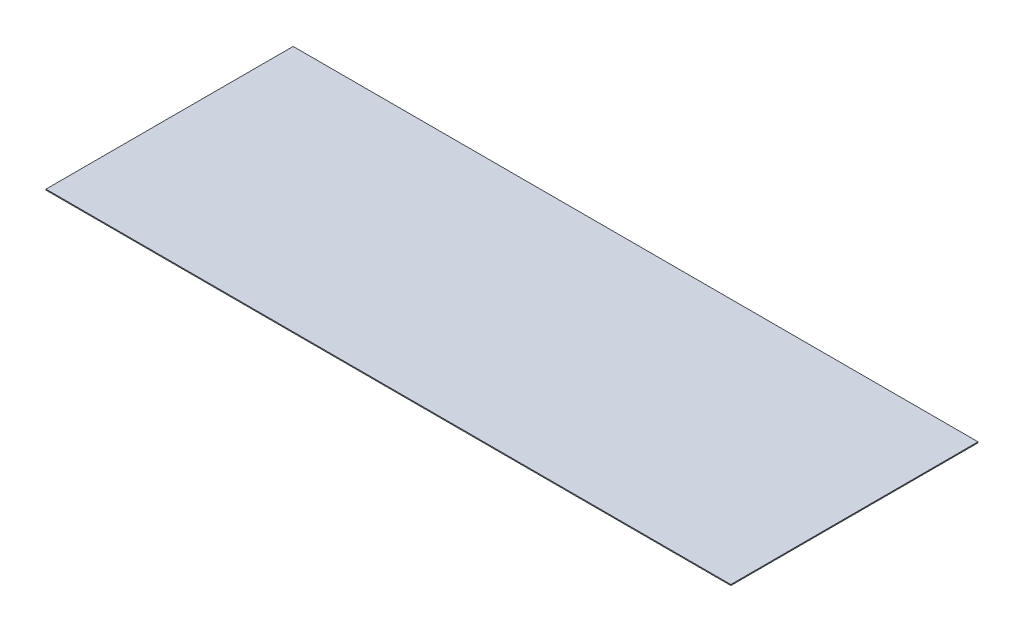
ISO-10303-21;
HEADER;
FILE_DESCRIPTION(('STEP AP214'),'2;1');
FILE_NAME('part.step','',(''),(''),'','','');
FILE_SCHEMA(('AUTOMOTIVE_DESIGN { 1 0 10303 214 1 1 1 1 }'));
ENDSEC;
DATA;
#1=APPLICATION_CONTEXT('core data for automotive mechanical design processes');
#2=APPLICATION_PROTOCOL_DEFINITION('international standard','automotive_design',2000,#1);
#3=PRODUCT_CONTEXT('',#1,'mechanical');
#4=PRODUCT('Part','Part','',(#3));
#5=PRODUCT_RELATED_PRODUCT_CATEGORY('part','',(#4));
#6=PRODUCT_DEFINITION_FORMATION('','',#4);
#7=PRODUCT_DEFINITION_CONTEXT('part definition',#1,'design');
#8=PRODUCT_DEFINITION('design','',#6,#7);
#9=PRODUCT_DEFINITION_SHAPE('','',#8);
#10=(LENGTH_UNIT() NAMED_UNIT(*) SI_UNIT(.MILLI.,.METRE.));
#11=(NAMED_UNIT(*) PLANE_ANGLE_UNIT() SI_UNIT($,.RADIAN.));
#12=(NAMED_UNIT(*) SI_UNIT($,.STERADIAN.) SOLID_ANGLE_UNIT());
#13=UNCERTAINTY_MEASURE_WITH_UNIT(LENGTH_MEASURE(1.E-05),#10,'distance_accuracy_value','');
#14=(GEOMETRIC_REPRESENTATION_CONTEXT(3) GLOBAL_UNCERTAINTY_ASSIGNED_CONTEXT((#13)) GLOBAL_UNIT_ASSIGNED_CONTEXT((#10,
#11,#12)) REPRESENTATION_CONTEXT('',''));
#15=CARTESIAN_POINT('',(0.,0.,0.));
#16=DIRECTION('',(0.,0.,1.));
#17=DIRECTION('',(1.,0.,0.));
#18=AXIS2_PLACEMENT_3D('',#15,#16,#17);
#19=CARTESIAN_POINT('',(-527.144686299616,1.5875,-240.749039692702));
#20=DIRECTION('',(1.,0.,0.));
#21=DIRECTION('',(0.,0.,-1.));
#22=AXIS2_PLACEMENT_3D('',#19,#20,#21);
#23=PLANE('',#22);
#24=DIRECTION('',(0.,0.,1.));
#25=VECTOR('',#24,1.);
#26=CARTESIAN_POINT('',(-527.144686299616,0.,-240.749039692702));
#27=LINE('',#26,#25);
#28=CARTESIAN_POINT('',(-527.144686299616,0.,-240.749039692702));
#29=VERTEX_POINT('',#28);
#30=CARTESIAN_POINT('',(-527.144686299616,0.,174.250960307298));
#31=VERTEX_POINT('',#30);
#32=EDGE_CURVE('E100',#29,#31,#27,.T.);
#33=ORIENTED_EDGE('',*,*,#32,.T.);
#34=DIRECTION('',(0.,-1.,0.));
#35=VECTOR('',#34,1.);
#36=CARTESIAN_POINT('',(-527.144686299616,1.5875,174.250960307298));
#37=LINE('',#36,#35);
#38=CARTESIAN_POINT('',(-527.144686299616,1.5875,174.250960307298));
#39=VERTEX_POINT('',#38);
#40=EDGE_CURVE('E11',#39,#31,#37,.T.);
#41=ORIENTED_EDGE('',*,*,#40,.F.);
#42=DIRECTION('',(0.,0.,1.));
#43=VECTOR('',#42,1.);
#44=CARTESIAN_POINT('',(-527.144686299616,1.5875,-240.749039692702));
#45=LINE('',#44,#43);
#46=CARTESIAN_POINT('',(-527.144686299616,1.5875,-240.749039692702));
#47=VERTEX_POINT('',#46);
#48=EDGE_CURVE('E88',#47,#39,#45,.T.);
#49=ORIENTED_EDGE('',*,*,#48,.F.);
#50=DIRECTION('',(0.,-1.,0.));
#51=VECTOR('',#50,1.);
#52=CARTESIAN_POINT('',(-527.144686299616,1.5875,-240.749039692702));
#53=LINE('',#52,#51);
#54=EDGE_CURVE('E96',#47,#29,#53,.T.);
#55=ORIENTED_EDGE('',*,*,#54,.T.);
#56=EDGE_LOOP('',(#33,#41,#49,#55));
#57=FACE_BOUND('',#56,.T.);
#58=ADVANCED_FACE('F37',(#57),#23,.F.);
#59=CARTESIAN_POINT('',(-527.144686299616,1.5875,174.250960307298));
#60=DIRECTION('',(0.,0.,-1.));
#61=DIRECTION('',(-1.,0.,0.));
#62=AXIS2_PLACEMENT_3D('',#59,#60,#61);
#63=PLANE('',#62);
#64=DIRECTION('',(1.,0.,0.));
#65=VECTOR('',#64,1.);
#66=CARTESIAN_POINT('',(-527.144686299616,0.,174.250960307298));
#67=LINE('',#66,#65);
#68=CARTESIAN_POINT('',(622.855313700384,0.,174.250960307298));
#69=VERTEX_POINT('',#68);
#70=EDGE_CURVE('E92',#31,#69,#67,.T.);
#71=ORIENTED_EDGE('',*,*,#70,.T.);
#72=DIRECTION('',(0.,-1.,0.));
#73=VECTOR('',#72,1.);
#74=CARTESIAN_POINT('',(622.855313700384,1.5875,174.250960307298));
#75=LINE('',#74,#73);
#76=CARTESIAN_POINT('',(622.855313700384,1.5875,174.250960307298));
#77=VERTEX_POINT('',#76);
#78=EDGE_CURVE('E45',#77,#69,#75,.T.);
#79=ORIENTED_EDGE('',*,*,#78,.F.);
#80=DIRECTION('',(1.,0.,0.));
#81=VECTOR('',#80,1.);
#82=CARTESIAN_POINT('',(-527.144686299616,1.5875,174.250960307298));
#83=LINE('',#82,#81);
#84=EDGE_CURVE('E83',#39,#77,#83,.T.);
#85=ORIENTED_EDGE('',*,*,#84,.F.);
#86=ORIENTED_EDGE('',*,*,#40,.T.);
#87=EDGE_LOOP('',(#71,#79,#85,#86));
#88=FACE_BOUND('',#87,.T.);
#89=ADVANCED_FACE('F91',(#88),#63,.F.);
#90=CARTESIAN_POINT('',(622.855313700384,1.5875,-240.749039692702));
#91=DIRECTION('',(-1.,0.,0.));
#92=DIRECTION('',(0.,0.,1.));
#93=AXIS2_PLACEMENT_3D('',#90,#91,#92);
#94=PLANE('',#93);
#95=DIRECTION('',(0.,0.,-1.));
#96=VECTOR('',#95,1.);
#97=CARTESIAN_POINT('',(622.855313700384,0.,-240.749039692702));
#98=LINE('',#97,#96);
#99=CARTESIAN_POINT('',(622.855313700384,0.,-240.749039692702));
#100=VERTEX_POINT('',#99);
#101=EDGE_CURVE('E70',#69,#100,#98,.T.);
#102=ORIENTED_EDGE('',*,*,#101,.T.);
#103=DIRECTION('',(0.,-1.,0.));
#104=VECTOR('',#103,1.);
#105=CARTESIAN_POINT('',(622.855313700384,1.5875,-240.749039692702));
#106=LINE('',#105,#104);
#107=CARTESIAN_POINT('',(622.855313700384,1.5875,-240.749039692702));
#108=VERTEX_POINT('',#107);
#109=EDGE_CURVE('E93',#108,#100,#106,.T.);
#110=ORIENTED_EDGE('',*,*,#109,.F.);
#111=DIRECTION('',(0.,0.,-1.));
#112=VECTOR('',#111,1.);
#113=CARTESIAN_POINT('',(622.855313700384,1.5875,-240.749039692702));
#114=LINE('',#113,#112);
#115=EDGE_CURVE('E86',#77,#108,#114,.T.);
#116=ORIENTED_EDGE('',*,*,#115,.F.);
#117=ORIENTED_EDGE('',*,*,#78,.T.);
#118=EDGE_LOOP('',(#102,#110,#116,#117));
#119=FACE_BOUND('',#118,.T.);
#120=ADVANCED_FACE('F94',(#119),#94,.F.);
#121=CARTESIAN_POINT('',(-527.144686299616,1.5875,-240.749039692702));
#122=DIRECTION('',(0.,0.,1.));
#123=DIRECTION('',(1.,0.,0.));
#124=AXIS2_PLACEMENT_3D('',#121,#122,#123);
#125=PLANE('',#124);
#126=DIRECTION('',(-1.,0.,0.));
#127=VECTOR('',#126,1.);
#128=CARTESIAN_POINT('',(-527.144686299616,0.,-240.749039692702));
#129=LINE('',#128,#127);
#130=EDGE_CURVE('E76',#100,#29,#129,.T.);
#131=ORIENTED_EDGE('',*,*,#130,.T.);
#132=ORIENTED_EDGE('',*,*,#54,.F.);
#133=DIRECTION('',(-1.,0.,0.));
#134=VECTOR('',#133,1.);
#135=CARTESIAN_POINT('',(-527.144686299616,1.5875,-240.749039692702));
#136=LINE('',#135,#134);
#137=EDGE_CURVE('E53',#108,#47,#136,.T.);
#138=ORIENTED_EDGE('',*,*,#137,.F.);
#139=ORIENTED_EDGE('',*,*,#109,.T.);
#140=EDGE_LOOP('',(#131,#132,#138,#139));
#141=FACE_BOUND('',#140,.T.);
#142=ADVANCED_FACE('F107',(#141),#125,.F.);
#143=CARTESIAN_POINT('',(0.,1.5875,0.));
#144=DIRECTION('',(0.,1.,0.));
#145=DIRECTION('',(0.,0.,1.));
#146=AXIS2_PLACEMENT_3D('',#143,#144,#145);
#147=PLANE('',#146);
#148=ORIENTED_EDGE('',*,*,#48,.T.);
#149=ORIENTED_EDGE('',*,*,#84,.T.);
#150=ORIENTED_EDGE('',*,*,#115,.T.);
#151=ORIENTED_EDGE('',*,*,#137,.T.);
#152=EDGE_LOOP('',(#148,#149,#150,#151));
#153=FACE_BOUND('',#152,.T.);
#154=ADVANCED_FACE('F84',(#153),#147,.T.);
#155=CARTESIAN_POINT('',(0.,0.,0.));
#156=DIRECTION('',(0.,1.,0.));
#157=DIRECTION('',(0.,0.,1.));
#158=AXIS2_PLACEMENT_3D('',#155,#156,#157);
#159=PLANE('',#158);
#160=ORIENTED_EDGE('',*,*,#32,.F.);
#161=ORIENTED_EDGE('',*,*,#130,.F.);
#162=ORIENTED_EDGE('',*,*,#101,.F.);
#163=ORIENTED_EDGE('',*,*,#70,.F.);
#164=EDGE_LOOP('',(#160,#161,#162,#163));
#165=FACE_BOUND('',#164,.T.);
#166=ADVANCED_FACE('F110',(#165),#159,.F.);
#167=CLOSED_SHELL('',(#58,#89,#120,#142,#154,#166));
#168=MANIFOLD_SOLID_BREP('B2',#167);
#169=ADVANCED_BREP_SHAPE_REPRESENTATION('',(#18,#168),#14);
#170=SHAPE_DEFINITION_REPRESENTATION(#9,#169);
ENDSEC;
END-ISO-10303-21;
